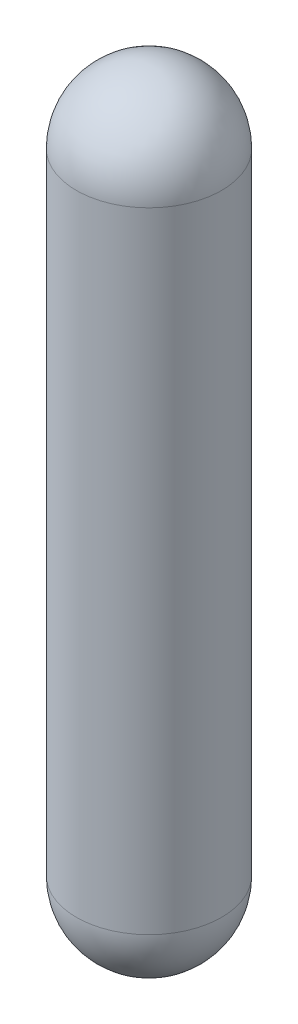
ISO-10303-21;
HEADER;
FILE_DESCRIPTION(('STEP AP214'),'2;1');
FILE_NAME('part.step','',(''),(''),'','','');
FILE_SCHEMA(('AUTOMOTIVE_DESIGN { 1 0 10303 214 1 1 1 1 }'));
ENDSEC;
DATA;
#1=APPLICATION_CONTEXT('core data for automotive mechanical design processes');
#2=APPLICATION_PROTOCOL_DEFINITION('international standard','automotive_design',2000,#1);
#3=PRODUCT_CONTEXT('',#1,'mechanical');
#4=PRODUCT('Part','Part','',(#3));
#5=PRODUCT_RELATED_PRODUCT_CATEGORY('part','',(#4));
#6=PRODUCT_DEFINITION_FORMATION('','',#4);
#7=PRODUCT_DEFINITION_CONTEXT('part definition',#1,'design');
#8=PRODUCT_DEFINITION('design','',#6,#7);
#9=PRODUCT_DEFINITION_SHAPE('','',#8);
#10=(LENGTH_UNIT() NAMED_UNIT(*) SI_UNIT(.MILLI.,.METRE.));
#11=(NAMED_UNIT(*) PLANE_ANGLE_UNIT() SI_UNIT($,.RADIAN.));
#12=(NAMED_UNIT(*) SI_UNIT($,.STERADIAN.) SOLID_ANGLE_UNIT());
#13=UNCERTAINTY_MEASURE_WITH_UNIT(LENGTH_MEASURE(1.E-05),#10,'distance_accuracy_value','');
#14=(GEOMETRIC_REPRESENTATION_CONTEXT(3) GLOBAL_UNCERTAINTY_ASSIGNED_CONTEXT((#13)) GLOBAL_UNIT_ASSIGNED_CONTEXT((#10,
#11,#12)) REPRESENTATION_CONTEXT('',''));
#15=CARTESIAN_POINT('',(0.,0.,0.));
#16=DIRECTION('',(0.,0.,1.));
#17=DIRECTION('',(1.,0.,0.));
#18=AXIS2_PLACEMENT_3D('',#15,#16,#17);
#19=CARTESIAN_POINT('',(0.,29.,0.));
#20=DIRECTION('',(0.,-1.,0.));
#21=DIRECTION('',(-1.,0.,0.));
#22=AXIS2_PLACEMENT_3D('',#19,#20,#21);
#23=SPHERICAL_SURFACE('',#22,3.);
#24=CARTESIAN_POINT('',(0.,29.,0.));
#25=DIRECTION('',(0.,-1.,0.));
#26=DIRECTION('',(0.,0.,-1.));
#27=AXIS2_PLACEMENT_3D('',#24,#25,#26);
#28=CIRCLE('',#27,3.);
#29=CARTESIAN_POINT('',(0.,29.,-3.));
#30=VERTEX_POINT('',#29);
#31=EDGE_CURVE('E39',#30,#30,#28,.T.);
#32=ORIENTED_EDGE('',*,*,#31,.F.);
#33=EDGE_LOOP('',(#32));
#34=FACE_BOUND('',#33,.T.);
#35=ADVANCED_FACE('F33',(#34),#23,.T.);
#36=CARTESIAN_POINT('',(0.,3.,0.));
#37=DIRECTION('',(0.,-1.,0.));
#38=DIRECTION('',(-1.,0.,0.));
#39=AXIS2_PLACEMENT_3D('',#36,#37,#38);
#40=SPHERICAL_SURFACE('',#39,3.);
#41=CARTESIAN_POINT('',(0.,3.,0.));
#42=DIRECTION('',(0.,-1.,0.));
#43=DIRECTION('',(0.,0.,-1.));
#44=AXIS2_PLACEMENT_3D('',#41,#42,#43);
#45=CIRCLE('',#44,3.);
#46=CARTESIAN_POINT('',(0.,3.,-3.));
#47=VERTEX_POINT('',#46);
#48=EDGE_CURVE('E10',#47,#47,#45,.T.);
#49=ORIENTED_EDGE('',*,*,#48,.T.);
#50=EDGE_LOOP('',(#49));
#51=FACE_BOUND('',#50,.T.);
#52=ADVANCED_FACE('F48',(#51),#40,.T.);
#53=CARTESIAN_POINT('',(0.,0.,0.));
#54=DIRECTION('',(0.,-1.,0.));
#55=DIRECTION('',(0.,0.,-1.));
#56=AXIS2_PLACEMENT_3D('',#53,#54,#55);
#57=CYLINDRICAL_SURFACE('',#56,3.);
#58=ORIENTED_EDGE('',*,*,#48,.F.);
#59=EDGE_LOOP('',(#58));
#60=FACE_BOUND('',#59,.T.);
#61=ORIENTED_EDGE('',*,*,#31,.T.);
#62=EDGE_LOOP('',(#61));
#63=FACE_BOUND('',#62,.T.);
#64=ADVANCED_FACE('F45',(#60,#63),#57,.T.);
#65=CLOSED_SHELL('',(#35,#52,#64));
#66=MANIFOLD_SOLID_BREP('B2',#65);
#67=ADVANCED_BREP_SHAPE_REPRESENTATION('',(#18,#66),#14);
#68=SHAPE_DEFINITION_REPRESENTATION(#9,#67);
ENDSEC;
END-ISO-10303-21;
